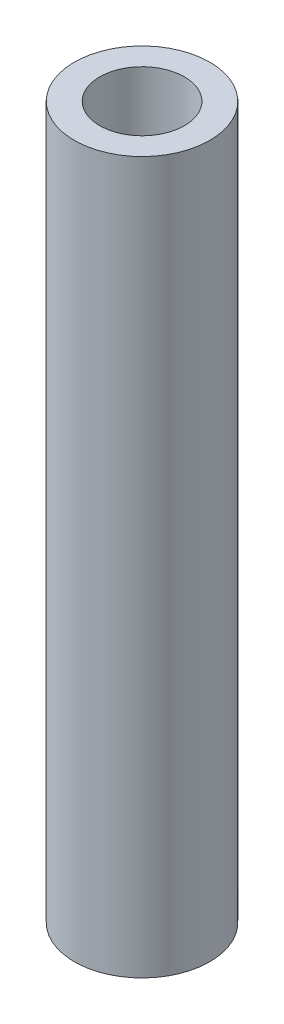
ISO-10303-21;
HEADER;
FILE_DESCRIPTION(('STEP AP214'),'2;1');
FILE_NAME('part.step','',(''),(''),'','','');
FILE_SCHEMA(('AUTOMOTIVE_DESIGN { 1 0 10303 214 1 1 1 1 }'));
ENDSEC;
DATA;
#1=APPLICATION_CONTEXT('core data for automotive mechanical design processes');
#2=APPLICATION_PROTOCOL_DEFINITION('international standard','automotive_design',2000,#1);
#3=PRODUCT_CONTEXT('',#1,'mechanical');
#4=PRODUCT('Part','Part','',(#3));
#5=PRODUCT_RELATED_PRODUCT_CATEGORY('part','',(#4));
#6=PRODUCT_DEFINITION_FORMATION('','',#4);
#7=PRODUCT_DEFINITION_CONTEXT('part definition',#1,'design');
#8=PRODUCT_DEFINITION('design','',#6,#7);
#9=PRODUCT_DEFINITION_SHAPE('','',#8);
#10=(LENGTH_UNIT() NAMED_UNIT(*) SI_UNIT(.MILLI.,.METRE.));
#11=(NAMED_UNIT(*) PLANE_ANGLE_UNIT() SI_UNIT($,.RADIAN.));
#12=(NAMED_UNIT(*) SI_UNIT($,.STERADIAN.) SOLID_ANGLE_UNIT());
#13=UNCERTAINTY_MEASURE_WITH_UNIT(LENGTH_MEASURE(1.E-05),#10,'distance_accuracy_value','');
#14=(GEOMETRIC_REPRESENTATION_CONTEXT(3) GLOBAL_UNCERTAINTY_ASSIGNED_CONTEXT((#13)) GLOBAL_UNIT_ASSIGNED_CONTEXT((#10,
#11,#12)) REPRESENTATION_CONTEXT('',''));
#15=CARTESIAN_POINT('',(0.,0.,0.));
#16=DIRECTION('',(0.,0.,1.));
#17=DIRECTION('',(1.,0.,0.));
#18=AXIS2_PLACEMENT_3D('',#15,#16,#17);
#19=CARTESIAN_POINT('',(0.,21.,0.));
#20=DIRECTION('',(0.,1.,0.));
#21=DIRECTION('',(0.,0.,1.));
#22=AXIS2_PLACEMENT_3D('',#19,#20,#21);
#23=PLANE('',#22);
#24=CARTESIAN_POINT('',(0.,21.,0.));
#25=DIRECTION('',(0.,1.,0.));
#26=DIRECTION('',(0.,0.,1.));
#27=AXIS2_PLACEMENT_3D('',#24,#25,#26);
#28=CIRCLE('',#27,2.);
#29=CARTESIAN_POINT('',(0.,21.,-2.));
#30=VERTEX_POINT('',#29);
#31=EDGE_CURVE('E10',#30,#30,#28,.T.);
#32=ORIENTED_EDGE('',*,*,#31,.T.);
#33=EDGE_LOOP('',(#32));
#34=FACE_BOUND('',#33,.T.);
#35=CARTESIAN_POINT('',(0.,21.,0.));
#36=DIRECTION('',(0.,1.,0.));
#37=DIRECTION('',(0.,0.,1.));
#38=AXIS2_PLACEMENT_3D('',#35,#36,#37);
#39=CIRCLE('',#38,1.25);
#40=CARTESIAN_POINT('',(0.,21.,-1.25));
#41=VERTEX_POINT('',#40);
#42=EDGE_CURVE('E43',#41,#41,#39,.T.);
#43=ORIENTED_EDGE('',*,*,#42,.F.);
#44=EDGE_LOOP('',(#43));
#45=FACE_BOUND('',#44,.T.);
#46=ADVANCED_FACE('F32',(#34,#45),#23,.T.);
#47=CARTESIAN_POINT('',(0.,0.,0.));
#48=DIRECTION('',(0.,1.,0.));
#49=DIRECTION('',(0.,0.,1.));
#50=AXIS2_PLACEMENT_3D('',#47,#48,#49);
#51=PLANE('',#50);
#52=CARTESIAN_POINT('',(0.,0.,0.));
#53=DIRECTION('',(0.,1.,0.));
#54=DIRECTION('',(0.,0.,1.));
#55=AXIS2_PLACEMENT_3D('',#52,#53,#54);
#56=CIRCLE('',#55,2.);
#57=CARTESIAN_POINT('',(0.,0.,-2.));
#58=VERTEX_POINT('',#57);
#59=EDGE_CURVE('E36',#58,#58,#56,.T.);
#60=ORIENTED_EDGE('',*,*,#59,.F.);
#61=EDGE_LOOP('',(#60));
#62=FACE_BOUND('',#61,.T.);
#63=CARTESIAN_POINT('',(0.,0.,0.));
#64=DIRECTION('',(0.,1.,0.));
#65=DIRECTION('',(0.,0.,1.));
#66=AXIS2_PLACEMENT_3D('',#63,#64,#65);
#67=CIRCLE('',#66,1.25);
#68=CARTESIAN_POINT('',(0.,0.,-1.25));
#69=VERTEX_POINT('',#68);
#70=EDGE_CURVE('E45',#69,#69,#67,.T.);
#71=ORIENTED_EDGE('',*,*,#70,.T.);
#72=EDGE_LOOP('',(#71));
#73=FACE_BOUND('',#72,.T.);
#74=ADVANCED_FACE('F55',(#62,#73),#51,.F.);
#75=CARTESIAN_POINT('',(0.,21.,0.));
#76=DIRECTION('',(0.,-1.,0.));
#77=DIRECTION('',(0.,0.,-1.));
#78=AXIS2_PLACEMENT_3D('',#75,#76,#77);
#79=CYLINDRICAL_SURFACE('',#78,2.);
#80=CARTESIAN_POINT('',(0.,21.,-2.));
#81=CARTESIAN_POINT('',(0.,20.78125,-2.));
#82=CARTESIAN_POINT('',(0.,20.5625,-2.));
#83=CARTESIAN_POINT('',(0.,20.125,-2.));
#84=CARTESIAN_POINT('',(0.,19.90625,-2.));
#85=CARTESIAN_POINT('',(0.,19.46875,-2.));
#86=CARTESIAN_POINT('',(0.,19.25,-2.));
#87=CARTESIAN_POINT('',(0.,18.8125,-2.));
#88=CARTESIAN_POINT('',(0.,18.59375,-2.));
#89=CARTESIAN_POINT('',(0.,18.15625,-2.));
#90=CARTESIAN_POINT('',(0.,17.9375,-2.));
#91=CARTESIAN_POINT('',(0.,17.5,-2.));
#92=CARTESIAN_POINT('',(0.,17.28125,-2.));
#93=CARTESIAN_POINT('',(0.,16.84375,-2.));
#94=CARTESIAN_POINT('',(0.,16.625,-2.));
#95=CARTESIAN_POINT('',(0.,16.1875,-2.));
#96=CARTESIAN_POINT('',(0.,15.96875,-2.));
#97=CARTESIAN_POINT('',(0.,15.53125,-2.));
#98=CARTESIAN_POINT('',(0.,15.3125,-2.));
#99=CARTESIAN_POINT('',(0.,14.875,-2.));
#100=CARTESIAN_POINT('',(0.,14.65625,-2.));
#101=CARTESIAN_POINT('',(0.,14.21875,-2.));
#102=CARTESIAN_POINT('',(0.,14.,-2.));
#103=CARTESIAN_POINT('',(0.,13.5625,-2.));
#104=CARTESIAN_POINT('',(0.,13.34375,-2.));
#105=CARTESIAN_POINT('',(0.,12.90625,-2.));
#106=CARTESIAN_POINT('',(0.,12.6875,-2.));
#107=CARTESIAN_POINT('',(0.,12.25,-2.));
#108=CARTESIAN_POINT('',(0.,12.03125,-2.));
#109=CARTESIAN_POINT('',(0.,11.59375,-2.));
#110=CARTESIAN_POINT('',(0.,11.375,-2.));
#111=CARTESIAN_POINT('',(0.,10.9375,-2.));
#112=CARTESIAN_POINT('',(0.,10.71875,-2.));
#113=CARTESIAN_POINT('',(0.,10.28125,-2.));
#114=CARTESIAN_POINT('',(0.,10.0625,-2.));
#115=CARTESIAN_POINT('',(0.,9.625,-2.));
#116=CARTESIAN_POINT('',(0.,9.40625,-2.));
#117=CARTESIAN_POINT('',(0.,8.96875,-2.));
#118=CARTESIAN_POINT('',(0.,8.75,-2.));
#119=CARTESIAN_POINT('',(0.,8.3125,-2.));
#120=CARTESIAN_POINT('',(0.,8.09375,-2.));
#121=CARTESIAN_POINT('',(0.,7.65625,-2.));
#122=CARTESIAN_POINT('',(0.,7.4375,-2.));
#123=CARTESIAN_POINT('',(0.,7.,-2.));
#124=CARTESIAN_POINT('',(0.,6.78125,-2.));
#125=CARTESIAN_POINT('',(0.,6.34375,-2.));
#126=CARTESIAN_POINT('',(0.,6.125,-2.));
#127=CARTESIAN_POINT('',(0.,5.6875,-2.));
#128=CARTESIAN_POINT('',(0.,5.46875,-2.));
#129=CARTESIAN_POINT('',(0.,5.03125,-2.));
#130=CARTESIAN_POINT('',(0.,4.8125,-2.));
#131=CARTESIAN_POINT('',(0.,4.375,-2.));
#132=CARTESIAN_POINT('',(0.,4.15625,-2.));
#133=CARTESIAN_POINT('',(0.,3.71875,-2.));
#134=CARTESIAN_POINT('',(0.,3.5,-2.));
#135=CARTESIAN_POINT('',(0.,3.0625,-2.));
#136=CARTESIAN_POINT('',(0.,2.84375,-2.));
#137=CARTESIAN_POINT('',(0.,2.40625,-2.));
#138=CARTESIAN_POINT('',(0.,2.1875,-2.));
#139=CARTESIAN_POINT('',(0.,1.75,-2.));
#140=CARTESIAN_POINT('',(0.,1.53125,-2.));
#141=CARTESIAN_POINT('',(0.,1.09375,-2.));
#142=CARTESIAN_POINT('',(0.,0.875000000000001,-2.));
#143=CARTESIAN_POINT('',(0.,0.4375,-2.));
#144=CARTESIAN_POINT('',(0.,0.21875,-2.));
#145=CARTESIAN_POINT('',(0.,0.,-2.));
#146=B_SPLINE_CURVE_WITH_KNOTS('',3,(#80,#81,#82,#83,#84,#85,#86,#87,#88,#89,#90,#91,#92,#93,
#94,#95,#96,#97,#98,#99,#100,#101,#102,#103,#104,#105,#106,#107,#108,#109,#110,#111,#112,#113,
#114,#115,#116,#117,#118,#119,#120,#121,#122,#123,#124,#125,#126,#127,#128,#129,#130,#131,#132,
#133,#134,#135,#136,#137,#138,#139,#140,#141,#142,#143,#144,#145),.UNSPECIFIED.,.F.,.F.,(4,2,2,
2,2,2,2,2,2,2,2,2,2,2,2,2,2,2,2,2,2,2,2,2,2,2,2,2,2,2,2,2,4),(0.,0.656250000000001,1.3125,
1.96875,2.625,3.28125,3.9375,4.59375,5.25,5.90625,6.5625,7.21875,7.875,8.53125,9.1875,9.84375,
10.5,11.15625,11.8125,12.46875,13.125,13.78125,14.4375,15.09375,15.75,16.40625,17.0625,17.71875,
18.375,19.03125,19.6875,20.34375,21.),.UNSPECIFIED.);
#147=EDGE_CURVE('BSEAM34',#30,#58,#146,.T.);
#148=ORIENTED_EDGE('',*,*,#31,.F.);
#149=ORIENTED_EDGE('',*,*,#59,.T.);
#150=ORIENTED_EDGE('',*,*,#147,.T.);
#151=ORIENTED_EDGE('',*,*,#147,.F.);
#152=EDGE_LOOP('',(#148,#150,#149,#151));
#153=FACE_BOUND('',#152,.T.);
#154=ADVANCED_FACE('F34',(#153),#79,.T.);
#155=CARTESIAN_POINT('',(0.,21.,0.));
#156=DIRECTION('',(0.,-1.,0.));
#157=DIRECTION('',(0.,0.,-1.));
#158=AXIS2_PLACEMENT_3D('',#155,#156,#157);
#159=CYLINDRICAL_SURFACE('',#158,1.25);
#160=CARTESIAN_POINT('',(0.,21.,-1.25));
#161=CARTESIAN_POINT('',(0.,20.78125,-1.25));
#162=CARTESIAN_POINT('',(0.,20.5625,-1.25));
#163=CARTESIAN_POINT('',(0.,20.125,-1.25));
#164=CARTESIAN_POINT('',(0.,19.90625,-1.25));
#165=CARTESIAN_POINT('',(0.,19.46875,-1.25));
#166=CARTESIAN_POINT('',(0.,19.25,-1.25));
#167=CARTESIAN_POINT('',(0.,18.8125,-1.25));
#168=CARTESIAN_POINT('',(0.,18.59375,-1.25));
#169=CARTESIAN_POINT('',(0.,18.15625,-1.25));
#170=CARTESIAN_POINT('',(0.,17.9375,-1.25));
#171=CARTESIAN_POINT('',(0.,17.5,-1.25));
#172=CARTESIAN_POINT('',(0.,17.28125,-1.25));
#173=CARTESIAN_POINT('',(0.,16.84375,-1.25));
#174=CARTESIAN_POINT('',(0.,16.625,-1.25));
#175=CARTESIAN_POINT('',(0.,16.1875,-1.25));
#176=CARTESIAN_POINT('',(0.,15.96875,-1.25));
#177=CARTESIAN_POINT('',(0.,15.53125,-1.25));
#178=CARTESIAN_POINT('',(0.,15.3125,-1.25));
#179=CARTESIAN_POINT('',(0.,14.875,-1.25));
#180=CARTESIAN_POINT('',(0.,14.65625,-1.25));
#181=CARTESIAN_POINT('',(0.,14.21875,-1.25));
#182=CARTESIAN_POINT('',(0.,14.,-1.25));
#183=CARTESIAN_POINT('',(0.,13.5625,-1.25));
#184=CARTESIAN_POINT('',(0.,13.34375,-1.25));
#185=CARTESIAN_POINT('',(0.,12.90625,-1.25));
#186=CARTESIAN_POINT('',(0.,12.6875,-1.25));
#187=CARTESIAN_POINT('',(0.,12.25,-1.25));
#188=CARTESIAN_POINT('',(0.,12.03125,-1.25));
#189=CARTESIAN_POINT('',(0.,11.59375,-1.25));
#190=CARTESIAN_POINT('',(0.,11.375,-1.25));
#191=CARTESIAN_POINT('',(0.,10.9375,-1.25));
#192=CARTESIAN_POINT('',(0.,10.71875,-1.25));
#193=CARTESIAN_POINT('',(0.,10.28125,-1.25));
#194=CARTESIAN_POINT('',(0.,10.0625,-1.25));
#195=CARTESIAN_POINT('',(0.,9.625,-1.25));
#196=CARTESIAN_POINT('',(0.,9.40625,-1.25));
#197=CARTESIAN_POINT('',(0.,8.96875,-1.25));
#198=CARTESIAN_POINT('',(0.,8.75,-1.25));
#199=CARTESIAN_POINT('',(0.,8.3125,-1.25));
#200=CARTESIAN_POINT('',(0.,8.09375,-1.25));
#201=CARTESIAN_POINT('',(0.,7.65625,-1.25));
#202=CARTESIAN_POINT('',(0.,7.4375,-1.25));
#203=CARTESIAN_POINT('',(0.,7.,-1.25));
#204=CARTESIAN_POINT('',(0.,6.78125,-1.25));
#205=CARTESIAN_POINT('',(0.,6.34375,-1.25));
#206=CARTESIAN_POINT('',(0.,6.125,-1.25));
#207=CARTESIAN_POINT('',(0.,5.6875,-1.25));
#208=CARTESIAN_POINT('',(0.,5.46875,-1.25));
#209=CARTESIAN_POINT('',(0.,5.03125,-1.25));
#210=CARTESIAN_POINT('',(0.,4.8125,-1.25));
#211=CARTESIAN_POINT('',(0.,4.375,-1.25));
#212=CARTESIAN_POINT('',(0.,4.15625,-1.25));
#213=CARTESIAN_POINT('',(0.,3.71875,-1.25));
#214=CARTESIAN_POINT('',(0.,3.5,-1.25));
#215=CARTESIAN_POINT('',(0.,3.0625,-1.25));
#216=CARTESIAN_POINT('',(0.,2.84375,-1.25));
#217=CARTESIAN_POINT('',(0.,2.40625,-1.25));
#218=CARTESIAN_POINT('',(0.,2.1875,-1.25));
#219=CARTESIAN_POINT('',(0.,1.75,-1.25));
#220=CARTESIAN_POINT('',(0.,1.53125,-1.25));
#221=CARTESIAN_POINT('',(0.,1.09375,-1.25));
#222=CARTESIAN_POINT('',(0.,0.875000000000001,-1.25));
#223=CARTESIAN_POINT('',(0.,0.4375,-1.25));
#224=CARTESIAN_POINT('',(0.,0.21875,-1.25));
#225=CARTESIAN_POINT('',(0.,0.,-1.25));
#226=B_SPLINE_CURVE_WITH_KNOTS('',3,(#160,#161,#162,#163,#164,#165,#166,#167,#168,#169,#170,
#171,#172,#173,#174,#175,#176,#177,#178,#179,#180,#181,#182,#183,#184,#185,#186,#187,#188,#189,
#190,#191,#192,#193,#194,#195,#196,#197,#198,#199,#200,#201,#202,#203,#204,#205,#206,#207,#208,
#209,#210,#211,#212,#213,#214,#215,#216,#217,#218,#219,#220,#221,#222,#223,#224,#225),
.UNSPECIFIED.,.F.,.F.,(4,2,2,2,2,2,2,2,2,2,2,2,2,2,2,2,2,2,2,2,2,2,2,2,2,2,2,2,2,2,2,2,4),(0.,
0.656250000000001,1.3125,1.96875,2.625,3.28125,3.9375,4.59375,5.25,5.90625,6.5625,7.21875,7.875,
8.53125,9.1875,9.84375,10.5,11.15625,11.8125,12.46875,13.125,13.78125,14.4375,15.09375,15.75,
16.40625,17.0625,17.71875,18.375,19.03125,19.6875,20.34375,21.),.UNSPECIFIED.);
#227=EDGE_CURVE('BSEAM51',#41,#69,#226,.T.);
#228=ORIENTED_EDGE('',*,*,#42,.T.);
#229=ORIENTED_EDGE('',*,*,#70,.F.);
#230=ORIENTED_EDGE('',*,*,#227,.T.);
#231=ORIENTED_EDGE('',*,*,#227,.F.);
#232=EDGE_LOOP('',(#228,#230,#229,#231));
#233=FACE_BOUND('',#232,.T.);
#234=ADVANCED_FACE('F51',(#233),#159,.F.);
#235=CLOSED_SHELL('',(#46,#74,#154,#234));
#236=MANIFOLD_SOLID_BREP('B2',#235);
#237=ADVANCED_BREP_SHAPE_REPRESENTATION('',(#18,#236),#14);
#238=SHAPE_DEFINITION_REPRESENTATION(#9,#237);
ENDSEC;
END-ISO-10303-21;
